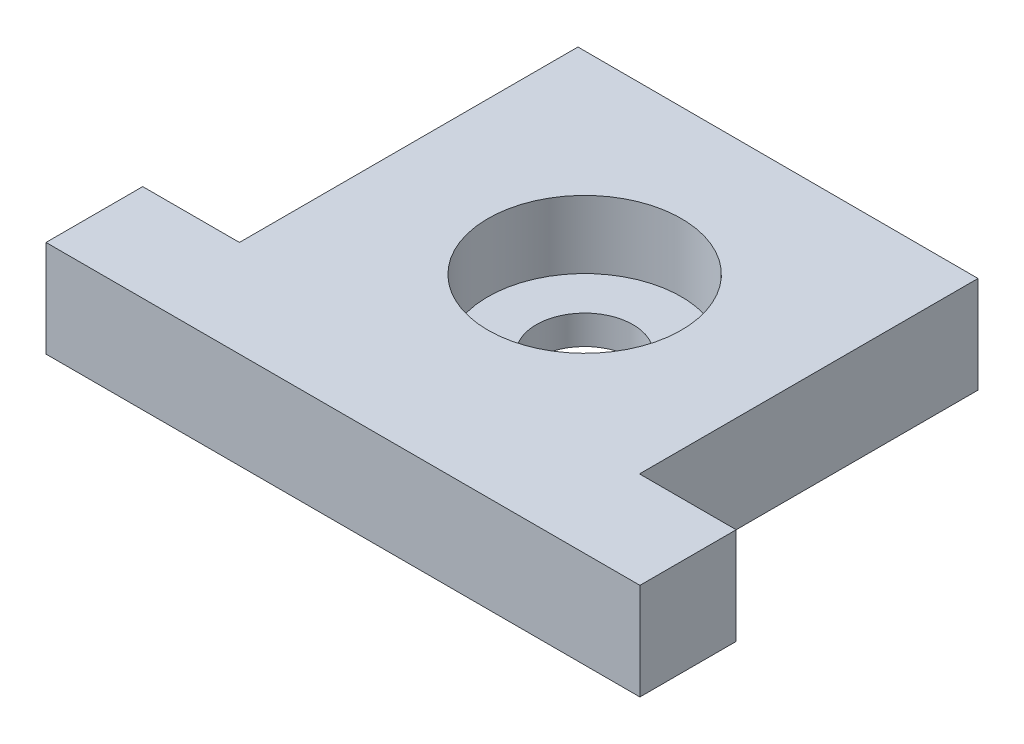
ISO-10303-21;
HEADER;
FILE_DESCRIPTION(('STEP AP214'),'2;1');
FILE_NAME('part.step','',(''),(''),'','','');
FILE_SCHEMA(('AUTOMOTIVE_DESIGN { 1 0 10303 214 1 1 1 1 }'));
ENDSEC;
DATA;
#1=APPLICATION_CONTEXT('core data for automotive mechanical design processes');
#2=APPLICATION_PROTOCOL_DEFINITION('international standard','automotive_design',2000,#1);
#3=PRODUCT_CONTEXT('',#1,'mechanical');
#4=PRODUCT('Part','Part','',(#3));
#5=PRODUCT_RELATED_PRODUCT_CATEGORY('part','',(#4));
#6=PRODUCT_DEFINITION_FORMATION('','',#4);
#7=PRODUCT_DEFINITION_CONTEXT('part definition',#1,'design');
#8=PRODUCT_DEFINITION('design','',#6,#7);
#9=PRODUCT_DEFINITION_SHAPE('','',#8);
#10=(LENGTH_UNIT() NAMED_UNIT(*) SI_UNIT(.MILLI.,.METRE.));
#11=(NAMED_UNIT(*) PLANE_ANGLE_UNIT() SI_UNIT($,.RADIAN.));
#12=(NAMED_UNIT(*) SI_UNIT($,.STERADIAN.) SOLID_ANGLE_UNIT());
#13=UNCERTAINTY_MEASURE_WITH_UNIT(LENGTH_MEASURE(1.E-05),#10,'distance_accuracy_value','');
#14=(GEOMETRIC_REPRESENTATION_CONTEXT(3) GLOBAL_UNCERTAINTY_ASSIGNED_CONTEXT((#13)) GLOBAL_UNIT_ASSIGNED_CONTEXT((#10,
#11,#12)) REPRESENTATION_CONTEXT('',''));
#15=CARTESIAN_POINT('',(0.,0.,0.));
#16=DIRECTION('',(0.,0.,1.));
#17=DIRECTION('',(1.,0.,0.));
#18=AXIS2_PLACEMENT_3D('',#15,#16,#17);
#19=CARTESIAN_POINT('',(0.0488752264672444,10.,-44.9774486167826));
#20=DIRECTION('',(0.00108666007329569,0.,-0.999999409584768));
#21=DIRECTION('',(-0.999999409584768,0.,-0.00108666007329569));
#22=AXIS2_PLACEMENT_3D('',#19,#20,#21);
#23=PLANE('',#22);
#24=DIRECTION('',(0.999999409584768,0.,0.00108666007329569));
#25=VECTOR('',#24,1.);
#26=CARTESIAN_POINT('',(0.0488752264672444,0.,-44.9774486167826));
#27=LINE('',#26,#25);
#28=CARTESIAN_POINT('',(-20.7040450812414,0.,-45.));
#29=VERTEX_POINT('',#28);
#30=CARTESIAN_POINT('',(20.7040450812414,0.,-44.9550034551423));
#31=VERTEX_POINT('',#30);
#32=EDGE_CURVE('E128',#29,#31,#27,.T.);
#33=ORIENTED_EDGE('',*,*,#32,.F.);
#34=DIRECTION('',(0.,-1.,0.));
#35=VECTOR('',#34,1.);
#36=CARTESIAN_POINT('',(-20.7040450812414,10.,-45.));
#37=LINE('',#36,#35);
#38=CARTESIAN_POINT('',(-20.7040450812414,10.,-45.));
#39=VERTEX_POINT('',#38);
#40=EDGE_CURVE('E11',#39,#29,#37,.T.);
#41=ORIENTED_EDGE('',*,*,#40,.F.);
#42=DIRECTION('',(0.999999409584768,0.,0.00108666007329569));
#43=VECTOR('',#42,1.);
#44=CARTESIAN_POINT('',(0.0488752264672444,10.,-44.9774486167826));
#45=LINE('',#44,#43);
#46=CARTESIAN_POINT('',(20.7040450812414,10.,-44.9550034551423));
#47=VERTEX_POINT('',#46);
#48=EDGE_CURVE('E147',#39,#47,#45,.T.);
#49=ORIENTED_EDGE('',*,*,#48,.T.);
#50=DIRECTION('',(0.,-1.,0.));
#51=VECTOR('',#50,1.);
#52=CARTESIAN_POINT('',(20.7040450812414,10.,-44.9550034551423));
#53=LINE('',#52,#51);
#54=EDGE_CURVE('E86',#47,#31,#53,.T.);
#55=ORIENTED_EDGE('',*,*,#54,.T.);
#56=EDGE_LOOP('',(#33,#41,#49,#55));
#57=FACE_BOUND('',#56,.T.);
#58=ADVANCED_FACE('F35',(#57),#23,.T.);
#59=CARTESIAN_POINT('',(-20.7040450812414,10.,0.));
#60=DIRECTION('',(-1.,0.,0.));
#61=DIRECTION('',(0.,0.,1.));
#62=AXIS2_PLACEMENT_3D('',#59,#60,#61);
#63=PLANE('',#62);
#64=DIRECTION('',(0.,0.,-1.));
#65=VECTOR('',#64,1.);
#66=CARTESIAN_POINT('',(-20.7040450812414,0.,0.));
#67=LINE('',#66,#65);
#68=CARTESIAN_POINT('',(-20.7040450812414,0.,-9.99999999999999));
#69=VERTEX_POINT('',#68);
#70=EDGE_CURVE('E131',#69,#29,#67,.T.);
#71=ORIENTED_EDGE('',*,*,#70,.F.);
#72=DIRECTION('',(0.,-1.,0.));
#73=VECTOR('',#72,1.);
#74=CARTESIAN_POINT('',(-20.7040450812414,10.,-9.99999999999999));
#75=LINE('',#74,#73);
#76=CARTESIAN_POINT('',(-20.7040450812414,10.,-9.99999999999999));
#77=VERTEX_POINT('',#76);
#78=EDGE_CURVE('E43',#77,#69,#75,.T.);
#79=ORIENTED_EDGE('',*,*,#78,.F.);
#80=DIRECTION('',(0.,0.,-1.));
#81=VECTOR('',#80,1.);
#82=CARTESIAN_POINT('',(-20.7040450812414,10.,0.));
#83=LINE('',#82,#81);
#84=EDGE_CURVE('E173',#77,#39,#83,.T.);
#85=ORIENTED_EDGE('',*,*,#84,.T.);
#86=ORIENTED_EDGE('',*,*,#40,.T.);
#87=EDGE_LOOP('',(#71,#79,#85,#86));
#88=FACE_BOUND('',#87,.T.);
#89=ADVANCED_FACE('F164',(#88),#63,.T.);
#90=CARTESIAN_POINT('',(0.,10.,-9.99999999999999));
#91=DIRECTION('',(0.,0.,-1.));
#92=DIRECTION('',(-1.,0.,0.));
#93=AXIS2_PLACEMENT_3D('',#90,#91,#92);
#94=PLANE('',#93);
#95=DIRECTION('',(1.,0.,0.));
#96=VECTOR('',#95,1.);
#97=CARTESIAN_POINT('',(0.,0.,-9.99999999999999));
#98=LINE('',#97,#96);
#99=CARTESIAN_POINT('',(-30.7040450812414,0.,-9.99999999999999));
#100=VERTEX_POINT('',#99);
#101=EDGE_CURVE('E135',#100,#69,#98,.T.);
#102=ORIENTED_EDGE('',*,*,#101,.F.);
#103=DIRECTION('',(0.,-1.,0.));
#104=VECTOR('',#103,1.);
#105=CARTESIAN_POINT('',(-30.7040450812414,10.,-9.99999999999999));
#106=LINE('',#105,#104);
#107=CARTESIAN_POINT('',(-30.7040450812414,10.,-9.99999999999999));
#108=VERTEX_POINT('',#107);
#109=EDGE_CURVE('E153',#108,#100,#106,.T.);
#110=ORIENTED_EDGE('',*,*,#109,.F.);
#111=DIRECTION('',(1.,0.,0.));
#112=VECTOR('',#111,1.);
#113=CARTESIAN_POINT('',(0.,10.,-9.99999999999999));
#114=LINE('',#113,#112);
#115=EDGE_CURVE('E160',#108,#77,#114,.T.);
#116=ORIENTED_EDGE('',*,*,#115,.T.);
#117=ORIENTED_EDGE('',*,*,#78,.T.);
#118=EDGE_LOOP('',(#102,#110,#116,#117));
#119=FACE_BOUND('',#118,.T.);
#120=ADVANCED_FACE('F158',(#119),#94,.T.);
#121=CARTESIAN_POINT('',(-30.7040450812414,10.,0.));
#122=DIRECTION('',(-1.,0.,0.));
#123=DIRECTION('',(0.,0.,1.));
#124=AXIS2_PLACEMENT_3D('',#121,#122,#123);
#125=PLANE('',#124);
#126=DIRECTION('',(0.,0.,-1.));
#127=VECTOR('',#126,1.);
#128=CARTESIAN_POINT('',(-30.7040450812414,0.,0.));
#129=LINE('',#128,#127);
#130=CARTESIAN_POINT('',(-30.7040450812414,0.,0.));
#131=VERTEX_POINT('',#130);
#132=EDGE_CURVE('E138',#131,#100,#129,.T.);
#133=ORIENTED_EDGE('',*,*,#132,.F.);
#134=DIRECTION('',(0.,-1.,0.));
#135=VECTOR('',#134,1.);
#136=CARTESIAN_POINT('',(-30.7040450812414,10.,0.));
#137=LINE('',#136,#135);
#138=CARTESIAN_POINT('',(-30.7040450812414,10.,0.));
#139=VERTEX_POINT('',#138);
#140=EDGE_CURVE('E151',#139,#131,#137,.T.);
#141=ORIENTED_EDGE('',*,*,#140,.F.);
#142=DIRECTION('',(0.,0.,-1.));
#143=VECTOR('',#142,1.);
#144=CARTESIAN_POINT('',(-30.7040450812414,10.,0.));
#145=LINE('',#144,#143);
#146=EDGE_CURVE('E172',#139,#108,#145,.T.);
#147=ORIENTED_EDGE('',*,*,#146,.T.);
#148=ORIENTED_EDGE('',*,*,#109,.T.);
#149=EDGE_LOOP('',(#133,#141,#147,#148));
#150=FACE_BOUND('',#149,.T.);
#151=ADVANCED_FACE('F170',(#150),#125,.T.);
#152=CARTESIAN_POINT('',(0.,10.,0.));
#153=DIRECTION('',(0.,0.,-1.));
#154=DIRECTION('',(-1.,0.,0.));
#155=AXIS2_PLACEMENT_3D('',#152,#153,#154);
#156=PLANE('',#155);
#157=DIRECTION('',(1.,0.,0.));
#158=VECTOR('',#157,1.);
#159=CARTESIAN_POINT('',(0.,0.,0.));
#160=LINE('',#159,#158);
#161=CARTESIAN_POINT('',(30.7040450812414,0.,0.));
#162=VERTEX_POINT('',#161);
#163=EDGE_CURVE('E141',#131,#162,#160,.T.);
#164=ORIENTED_EDGE('',*,*,#163,.T.);
#165=DIRECTION('',(0.,-1.,0.));
#166=VECTOR('',#165,1.);
#167=CARTESIAN_POINT('',(30.7040450812414,10.,0.));
#168=LINE('',#167,#166);
#169=CARTESIAN_POINT('',(30.7040450812414,10.,0.));
#170=VERTEX_POINT('',#169);
#171=EDGE_CURVE('E120',#170,#162,#168,.T.);
#172=ORIENTED_EDGE('',*,*,#171,.F.);
#173=DIRECTION('',(1.,0.,0.));
#174=VECTOR('',#173,1.);
#175=CARTESIAN_POINT('',(0.,10.,0.));
#176=LINE('',#175,#174);
#177=EDGE_CURVE('E111',#139,#170,#176,.T.);
#178=ORIENTED_EDGE('',*,*,#177,.F.);
#179=ORIENTED_EDGE('',*,*,#140,.T.);
#180=EDGE_LOOP('',(#164,#172,#178,#179));
#181=FACE_BOUND('',#180,.T.);
#182=ADVANCED_FACE('F232',(#181),#156,.F.);
#183=CARTESIAN_POINT('',(30.7040450812414,10.,0.));
#184=DIRECTION('',(-1.,0.,0.));
#185=DIRECTION('',(0.,0.,1.));
#186=AXIS2_PLACEMENT_3D('',#183,#184,#185);
#187=PLANE('',#186);
#188=DIRECTION('',(0.,0.,-1.));
#189=VECTOR('',#188,1.);
#190=CARTESIAN_POINT('',(30.7040450812414,0.,0.));
#191=LINE('',#190,#189);
#192=CARTESIAN_POINT('',(30.7040450812414,0.,-9.95500345514235));
#193=VERTEX_POINT('',#192);
#194=EDGE_CURVE('E119',#162,#193,#191,.T.);
#195=ORIENTED_EDGE('',*,*,#194,.T.);
#196=DIRECTION('',(0.,-1.,0.));
#197=VECTOR('',#196,1.);
#198=CARTESIAN_POINT('',(30.7040450812414,10.,-9.95500345514235));
#199=LINE('',#198,#197);
#200=CARTESIAN_POINT('',(30.7040450812414,10.,-9.95500345514235));
#201=VERTEX_POINT('',#200);
#202=EDGE_CURVE('E116',#201,#193,#199,.T.);
#203=ORIENTED_EDGE('',*,*,#202,.F.);
#204=DIRECTION('',(0.,0.,-1.));
#205=VECTOR('',#204,1.);
#206=CARTESIAN_POINT('',(30.7040450812414,10.,0.));
#207=LINE('',#206,#205);
#208=EDGE_CURVE('E104',#170,#201,#207,.T.);
#209=ORIENTED_EDGE('',*,*,#208,.F.);
#210=ORIENTED_EDGE('',*,*,#171,.T.);
#211=EDGE_LOOP('',(#195,#203,#209,#210));
#212=FACE_BOUND('',#211,.T.);
#213=ADVANCED_FACE('F117',(#212),#187,.F.);
#214=CARTESIAN_POINT('',(0.,10.,-9.95500345514234));
#215=DIRECTION('',(0.,0.,1.));
#216=DIRECTION('',(1.,0.,0.));
#217=AXIS2_PLACEMENT_3D('',#214,#215,#216);
#218=PLANE('',#217);
#219=DIRECTION('',(-1.,0.,0.));
#220=VECTOR('',#219,1.);
#221=CARTESIAN_POINT('',(0.,0.,-9.95500345514234));
#222=LINE('',#221,#220);
#223=CARTESIAN_POINT('',(20.7040450812414,0.,-9.95500345514235));
#224=VERTEX_POINT('',#223);
#225=EDGE_CURVE('E79',#193,#224,#222,.T.);
#226=ORIENTED_EDGE('',*,*,#225,.T.);
#227=DIRECTION('',(0.,-1.,0.));
#228=VECTOR('',#227,1.);
#229=CARTESIAN_POINT('',(20.7040450812414,10.,-9.95500345514235));
#230=LINE('',#229,#228);
#231=CARTESIAN_POINT('',(20.7040450812414,10.,-9.95500345514235));
#232=VERTEX_POINT('',#231);
#233=EDGE_CURVE('E121',#232,#224,#230,.T.);
#234=ORIENTED_EDGE('',*,*,#233,.F.);
#235=DIRECTION('',(-1.,0.,0.));
#236=VECTOR('',#235,1.);
#237=CARTESIAN_POINT('',(0.,10.,-9.95500345514234));
#238=LINE('',#237,#236);
#239=EDGE_CURVE('E108',#201,#232,#238,.T.);
#240=ORIENTED_EDGE('',*,*,#239,.F.);
#241=ORIENTED_EDGE('',*,*,#202,.T.);
#242=EDGE_LOOP('',(#226,#234,#240,#241));
#243=FACE_BOUND('',#242,.T.);
#244=ADVANCED_FACE('F123',(#243),#218,.F.);
#245=CARTESIAN_POINT('',(20.7040450812414,10.,0.));
#246=DIRECTION('',(-1.,0.,0.));
#247=DIRECTION('',(0.,0.,1.));
#248=AXIS2_PLACEMENT_3D('',#245,#246,#247);
#249=PLANE('',#248);
#250=DIRECTION('',(0.,0.,-1.));
#251=VECTOR('',#250,1.);
#252=CARTESIAN_POINT('',(20.7040450812414,0.,0.));
#253=LINE('',#252,#251);
#254=EDGE_CURVE('E145',#224,#31,#253,.T.);
#255=ORIENTED_EDGE('',*,*,#254,.T.);
#256=ORIENTED_EDGE('',*,*,#54,.F.);
#257=DIRECTION('',(0.,0.,-1.));
#258=VECTOR('',#257,1.);
#259=CARTESIAN_POINT('',(20.7040450812414,10.,0.));
#260=LINE('',#259,#258);
#261=EDGE_CURVE('E51',#232,#47,#260,.T.);
#262=ORIENTED_EDGE('',*,*,#261,.F.);
#263=ORIENTED_EDGE('',*,*,#233,.T.);
#264=EDGE_LOOP('',(#255,#256,#262,#263));
#265=FACE_BOUND('',#264,.T.);
#266=ADVANCED_FACE('F211',(#265),#249,.F.);
#267=CARTESIAN_POINT('',(0.,10.,0.));
#268=DIRECTION('',(0.,1.,0.));
#269=DIRECTION('',(0.,0.,1.));
#270=AXIS2_PLACEMENT_3D('',#267,#268,#269);
#271=PLANE('',#270);
#272=CARTESIAN_POINT('',(0.,10.,-24.98875086));
#273=DIRECTION('',(0.,1.,0.));
#274=DIRECTION('',(0.,0.,1.));
#275=AXIS2_PLACEMENT_3D('',#272,#273,#274);
#276=CIRCLE('',#275,10.);
#277=CARTESIAN_POINT('',(0.,10.,-14.98875086));
#278=VERTEX_POINT('',#277);
#279=EDGE_CURVE('E179',#278,#278,#276,.T.);
#280=ORIENTED_EDGE('',*,*,#279,.F.);
#281=EDGE_LOOP('',(#280));
#282=FACE_BOUND('',#281,.T.);
#283=ORIENTED_EDGE('',*,*,#48,.F.);
#284=ORIENTED_EDGE('',*,*,#84,.F.);
#285=ORIENTED_EDGE('',*,*,#115,.F.);
#286=ORIENTED_EDGE('',*,*,#146,.F.);
#287=ORIENTED_EDGE('',*,*,#177,.T.);
#288=ORIENTED_EDGE('',*,*,#208,.T.);
#289=ORIENTED_EDGE('',*,*,#239,.T.);
#290=ORIENTED_EDGE('',*,*,#261,.T.);
#291=EDGE_LOOP('',(#283,#284,#285,#286,#287,#288,#289,#290));
#292=FACE_BOUND('',#291,.T.);
#293=ADVANCED_FACE('F106',(#282,#292),#271,.T.);
#294=CARTESIAN_POINT('',(0.,0.,0.));
#295=DIRECTION('',(0.,1.,0.));
#296=DIRECTION('',(0.,0.,1.));
#297=AXIS2_PLACEMENT_3D('',#294,#295,#296);
#298=PLANE('',#297);
#299=CARTESIAN_POINT('',(0.,0.,-24.98875086));
#300=DIRECTION('',(0.,1.,0.));
#301=DIRECTION('',(0.,0.,1.));
#302=AXIS2_PLACEMENT_3D('',#299,#300,#301);
#303=CIRCLE('',#302,5.);
#304=CARTESIAN_POINT('',(0.,0.,-19.98875086));
#305=VERTEX_POINT('',#304);
#306=EDGE_CURVE('E182',#305,#305,#303,.T.);
#307=ORIENTED_EDGE('',*,*,#306,.T.);
#308=EDGE_LOOP('',(#307));
#309=FACE_BOUND('',#308,.T.);
#310=ORIENTED_EDGE('',*,*,#32,.T.);
#311=ORIENTED_EDGE('',*,*,#254,.F.);
#312=ORIENTED_EDGE('',*,*,#225,.F.);
#313=ORIENTED_EDGE('',*,*,#194,.F.);
#314=ORIENTED_EDGE('',*,*,#163,.F.);
#315=ORIENTED_EDGE('',*,*,#132,.T.);
#316=ORIENTED_EDGE('',*,*,#101,.T.);
#317=ORIENTED_EDGE('',*,*,#70,.T.);
#318=EDGE_LOOP('',(#310,#311,#312,#313,#314,#315,#316,#317));
#319=FACE_BOUND('',#318,.T.);
#320=ADVANCED_FACE('F166',(#309,#319),#298,.F.);
#321=CARTESIAN_POINT('',(0.,3.,-24.98875086));
#322=DIRECTION('',(0.,1.,0.));
#323=DIRECTION('',(0.,0.,1.));
#324=AXIS2_PLACEMENT_3D('',#321,#322,#323);
#325=CYLINDRICAL_SURFACE('',#324,10.);
#326=CARTESIAN_POINT('',(0.,3.,-24.98875086));
#327=DIRECTION('',(0.,1.,0.));
#328=DIRECTION('',(0.,0.,1.));
#329=AXIS2_PLACEMENT_3D('',#326,#327,#328);
#330=CIRCLE('',#329,10.);
#331=CARTESIAN_POINT('',(0.,3.,-14.98875086));
#332=VERTEX_POINT('',#331);
#333=EDGE_CURVE('E132',#332,#332,#330,.T.);
#334=ORIENTED_EDGE('',*,*,#333,.F.);
#335=EDGE_LOOP('',(#334));
#336=FACE_BOUND('',#335,.T.);
#337=ORIENTED_EDGE('',*,*,#279,.T.);
#338=EDGE_LOOP('',(#337));
#339=FACE_BOUND('',#338,.T.);
#340=ADVANCED_FACE('F201',(#336,#339),#325,.F.);
#341=CARTESIAN_POINT('',(0.,3.,-24.98875086));
#342=DIRECTION('',(0.,1.,0.));
#343=DIRECTION('',(0.,0.,1.));
#344=AXIS2_PLACEMENT_3D('',#341,#342,#343);
#345=PLANE('',#344);
#346=CARTESIAN_POINT('',(0.,3.,-24.98875086));
#347=DIRECTION('',(0.,1.,0.));
#348=DIRECTION('',(0.,0.,1.));
#349=AXIS2_PLACEMENT_3D('',#346,#347,#348);
#350=CIRCLE('',#349,5.);
#351=CARTESIAN_POINT('',(0.,3.,-19.98875086));
#352=VERTEX_POINT('',#351);
#353=EDGE_CURVE('E185',#352,#352,#350,.T.);
#354=ORIENTED_EDGE('',*,*,#353,.F.);
#355=EDGE_LOOP('',(#354));
#356=FACE_BOUND('',#355,.T.);
#357=ORIENTED_EDGE('',*,*,#333,.T.);
#358=EDGE_LOOP('',(#357));
#359=FACE_BOUND('',#358,.T.);
#360=ADVANCED_FACE('F195',(#356,#359),#345,.T.);
#361=CARTESIAN_POINT('',(0.,0.,-24.98875086));
#362=DIRECTION('',(0.,1.,0.));
#363=DIRECTION('',(0.,0.,1.));
#364=AXIS2_PLACEMENT_3D('',#361,#362,#363);
#365=CYLINDRICAL_SURFACE('',#364,5.);
#366=ORIENTED_EDGE('',*,*,#306,.F.);
#367=EDGE_LOOP('',(#366));
#368=FACE_BOUND('',#367,.T.);
#369=ORIENTED_EDGE('',*,*,#353,.T.);
#370=EDGE_LOOP('',(#369));
#371=FACE_BOUND('',#370,.T.);
#372=ADVANCED_FACE('F192',(#368,#371),#365,.F.);
#373=CLOSED_SHELL('',(#58,#89,#120,#151,#182,#213,#244,#266,#293,#320,#340,#360,#372));
#374=MANIFOLD_SOLID_BREP('B2',#373);
#375=ADVANCED_BREP_SHAPE_REPRESENTATION('',(#18,#374),#14);
#376=SHAPE_DEFINITION_REPRESENTATION(#9,#375);
ENDSEC;
END-ISO-10303-21;
